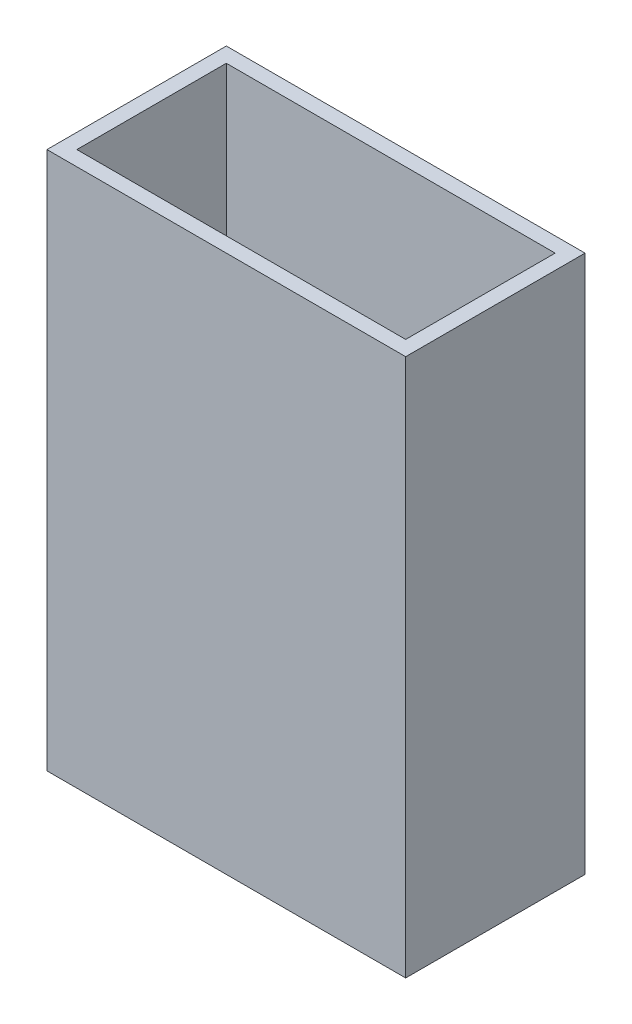
ISO-10303-21;
HEADER;
FILE_DESCRIPTION(('STEP AP214'),'2;1');
FILE_NAME('part.step','',(''),(''),'','','');
FILE_SCHEMA(('AUTOMOTIVE_DESIGN { 1 0 10303 214 1 1 1 1 }'));
ENDSEC;
DATA;
#1=APPLICATION_CONTEXT('core data for automotive mechanical design processes');
#2=APPLICATION_PROTOCOL_DEFINITION('international standard','automotive_design',2000,#1);
#3=PRODUCT_CONTEXT('',#1,'mechanical');
#4=PRODUCT('Part','Part','',(#3));
#5=PRODUCT_RELATED_PRODUCT_CATEGORY('part','',(#4));
#6=PRODUCT_DEFINITION_FORMATION('','',#4);
#7=PRODUCT_DEFINITION_CONTEXT('part definition',#1,'design');
#8=PRODUCT_DEFINITION('design','',#6,#7);
#9=PRODUCT_DEFINITION_SHAPE('','',#8);
#10=(LENGTH_UNIT() NAMED_UNIT(*) SI_UNIT(.MILLI.,.METRE.));
#11=(NAMED_UNIT(*) PLANE_ANGLE_UNIT() SI_UNIT($,.RADIAN.));
#12=(NAMED_UNIT(*) SI_UNIT($,.STERADIAN.) SOLID_ANGLE_UNIT());
#13=UNCERTAINTY_MEASURE_WITH_UNIT(LENGTH_MEASURE(1.E-05),#10,'distance_accuracy_value','');
#14=(GEOMETRIC_REPRESENTATION_CONTEXT(3) GLOBAL_UNCERTAINTY_ASSIGNED_CONTEXT((#13)) GLOBAL_UNIT_ASSIGNED_CONTEXT((#10,
#11,#12)) REPRESENTATION_CONTEXT('',''));
#15=CARTESIAN_POINT('',(0.,0.,0.));
#16=DIRECTION('',(0.,0.,1.));
#17=DIRECTION('',(1.,0.,0.));
#18=AXIS2_PLACEMENT_3D('',#15,#16,#17);
#19=CARTESIAN_POINT('',(0.,228.6,76.2));
#20=DIRECTION('',(0.,-1.,0.));
#21=DIRECTION('',(0.,0.,-1.));
#22=AXIS2_PLACEMENT_3D('',#19,#20,#21);
#23=PLANE('',#22);
#24=DIRECTION('',(-1.,0.,0.));
#25=VECTOR('',#24,1.);
#26=CARTESIAN_POINT('',(0.,228.6,0.));
#27=LINE('',#26,#25);
#28=CARTESIAN_POINT('',(152.4,228.6,0.));
#29=VERTEX_POINT('',#28);
#30=CARTESIAN_POINT('',(0.,228.6,0.));
#31=VERTEX_POINT('',#30);
#32=EDGE_CURVE('E83',#29,#31,#27,.T.);
#33=ORIENTED_EDGE('',*,*,#32,.T.);
#34=DIRECTION('',(0.,0.,-1.));
#35=VECTOR('',#34,1.);
#36=CARTESIAN_POINT('',(0.,228.6,76.2));
#37=LINE('',#36,#35);
#38=CARTESIAN_POINT('',(0.,228.6,76.2));
#39=VERTEX_POINT('',#38);
#40=EDGE_CURVE('E155',#39,#31,#37,.T.);
#41=ORIENTED_EDGE('',*,*,#40,.F.);
#42=DIRECTION('',(-1.,0.,0.));
#43=VECTOR('',#42,1.);
#44=CARTESIAN_POINT('',(0.,228.6,76.2));
#45=LINE('',#44,#43);
#46=CARTESIAN_POINT('',(152.4,228.6,76.2));
#47=VERTEX_POINT('',#46);
#48=EDGE_CURVE('E62',#47,#39,#45,.T.);
#49=ORIENTED_EDGE('',*,*,#48,.F.);
#50=DIRECTION('',(0.,0.,-1.));
#51=VECTOR('',#50,1.);
#52=CARTESIAN_POINT('',(152.4,228.6,76.2));
#53=LINE('',#52,#51);
#54=EDGE_CURVE('E165',#47,#29,#53,.T.);
#55=ORIENTED_EDGE('',*,*,#54,.T.);
#56=EDGE_LOOP('',(#33,#41,#49,#55));
#57=FACE_BOUND('',#56,.T.);
#58=DIRECTION('',(-1.,0.,0.));
#59=VECTOR('',#58,1.);
#60=CARTESIAN_POINT('',(0.,228.6,6.35));
#61=LINE('',#60,#59);
#62=CARTESIAN_POINT('',(146.05,228.6,6.35));
#63=VERTEX_POINT('',#62);
#64=CARTESIAN_POINT('',(6.35,228.6,6.35));
#65=VERTEX_POINT('',#64);
#66=EDGE_CURVE('E136',#63,#65,#61,.T.);
#67=ORIENTED_EDGE('',*,*,#66,.F.);
#68=DIRECTION('',(0.,0.,-1.));
#69=VECTOR('',#68,1.);
#70=CARTESIAN_POINT('',(146.05,228.6,76.2));
#71=LINE('',#70,#69);
#72=CARTESIAN_POINT('',(146.05,228.6,69.85));
#73=VERTEX_POINT('',#72);
#74=EDGE_CURVE('E131',#73,#63,#71,.T.);
#75=ORIENTED_EDGE('',*,*,#74,.F.);
#76=DIRECTION('',(-1.,0.,0.));
#77=VECTOR('',#76,1.);
#78=CARTESIAN_POINT('',(0.,228.6,69.85));
#79=LINE('',#78,#77);
#80=CARTESIAN_POINT('',(6.35,228.6,69.85));
#81=VERTEX_POINT('',#80);
#82=EDGE_CURVE('E53',#73,#81,#79,.T.);
#83=ORIENTED_EDGE('',*,*,#82,.T.);
#84=DIRECTION('',(0.,0.,-1.));
#85=VECTOR('',#84,1.);
#86=CARTESIAN_POINT('',(6.35,228.6,76.2));
#87=LINE('',#86,#85);
#88=EDGE_CURVE('E144',#81,#65,#87,.T.);
#89=ORIENTED_EDGE('',*,*,#88,.T.);
#90=EDGE_LOOP('',(#67,#75,#83,#89));
#91=FACE_BOUND('',#90,.T.);
#92=ADVANCED_FACE('F38',(#57,#91),#23,.F.);
#93=CARTESIAN_POINT('',(0.,0.,76.2));
#94=DIRECTION('',(1.,0.,0.));
#95=DIRECTION('',(0.,0.,-1.));
#96=AXIS2_PLACEMENT_3D('',#93,#94,#95);
#97=PLANE('',#96);
#98=DIRECTION('',(0.,-1.,0.));
#99=VECTOR('',#98,1.);
#100=CARTESIAN_POINT('',(0.,0.,0.));
#101=LINE('',#100,#99);
#102=CARTESIAN_POINT('',(0.,0.,0.));
#103=VERTEX_POINT('',#102);
#104=EDGE_CURVE('E156',#31,#103,#101,.T.);
#105=ORIENTED_EDGE('',*,*,#104,.T.);
#106=DIRECTION('',(0.,0.,-1.));
#107=VECTOR('',#106,1.);
#108=CARTESIAN_POINT('',(0.,0.,76.2));
#109=LINE('',#108,#107);
#110=CARTESIAN_POINT('',(0.,0.,76.2));
#111=VERTEX_POINT('',#110);
#112=EDGE_CURVE('E11',#111,#103,#109,.T.);
#113=ORIENTED_EDGE('',*,*,#112,.F.);
#114=DIRECTION('',(0.,-1.,0.));
#115=VECTOR('',#114,1.);
#116=CARTESIAN_POINT('',(0.,0.,76.2));
#117=LINE('',#116,#115);
#118=EDGE_CURVE('E149',#39,#111,#117,.T.);
#119=ORIENTED_EDGE('',*,*,#118,.F.);
#120=ORIENTED_EDGE('',*,*,#40,.T.);
#121=EDGE_LOOP('',(#105,#113,#119,#120));
#122=FACE_BOUND('',#121,.T.);
#123=ADVANCED_FACE('F40',(#122),#97,.F.);
#124=CARTESIAN_POINT('',(0.,0.,76.2));
#125=DIRECTION('',(0.,1.,0.));
#126=DIRECTION('',(0.,0.,1.));
#127=AXIS2_PLACEMENT_3D('',#124,#125,#126);
#128=PLANE('',#127);
#129=DIRECTION('',(1.,0.,0.));
#130=VECTOR('',#129,1.);
#131=CARTESIAN_POINT('',(0.,0.,0.));
#132=LINE('',#131,#130);
#133=CARTESIAN_POINT('',(152.4,0.,0.));
#134=VERTEX_POINT('',#133);
#135=EDGE_CURVE('E159',#103,#134,#132,.T.);
#136=ORIENTED_EDGE('',*,*,#135,.T.);
#137=DIRECTION('',(0.,0.,-1.));
#138=VECTOR('',#137,1.);
#139=CARTESIAN_POINT('',(152.4,0.,76.2));
#140=LINE('',#139,#138);
#141=CARTESIAN_POINT('',(152.4,0.,76.2));
#142=VERTEX_POINT('',#141);
#143=EDGE_CURVE('E46',#142,#134,#140,.T.);
#144=ORIENTED_EDGE('',*,*,#143,.F.);
#145=DIRECTION('',(1.,0.,0.));
#146=VECTOR('',#145,1.);
#147=CARTESIAN_POINT('',(0.,0.,76.2));
#148=LINE('',#147,#146);
#149=EDGE_CURVE('E90',#111,#142,#148,.T.);
#150=ORIENTED_EDGE('',*,*,#149,.F.);
#151=ORIENTED_EDGE('',*,*,#112,.T.);
#152=EDGE_LOOP('',(#136,#144,#150,#151));
#153=FACE_BOUND('',#152,.T.);
#154=ADVANCED_FACE('F204',(#153),#128,.F.);
#155=CARTESIAN_POINT('',(152.4,0.,76.2));
#156=DIRECTION('',(-1.,0.,0.));
#157=DIRECTION('',(0.,0.,1.));
#158=AXIS2_PLACEMENT_3D('',#155,#156,#157);
#159=PLANE('',#158);
#160=DIRECTION('',(0.,1.,0.));
#161=VECTOR('',#160,1.);
#162=CARTESIAN_POINT('',(152.4,0.,0.));
#163=LINE('',#162,#161);
#164=EDGE_CURVE('E161',#134,#29,#163,.T.);
#165=ORIENTED_EDGE('',*,*,#164,.T.);
#166=ORIENTED_EDGE('',*,*,#54,.F.);
#167=DIRECTION('',(0.,1.,0.));
#168=VECTOR('',#167,1.);
#169=CARTESIAN_POINT('',(152.4,0.,76.2));
#170=LINE('',#169,#168);
#171=EDGE_CURVE('E152',#142,#47,#170,.T.);
#172=ORIENTED_EDGE('',*,*,#171,.F.);
#173=ORIENTED_EDGE('',*,*,#143,.T.);
#174=EDGE_LOOP('',(#165,#166,#172,#173));
#175=FACE_BOUND('',#174,.T.);
#176=ADVANCED_FACE('F170',(#175),#159,.F.);
#177=CARTESIAN_POINT('',(0.,0.,76.2));
#178=DIRECTION('',(0.,0.,-1.));
#179=DIRECTION('',(-1.,0.,0.));
#180=AXIS2_PLACEMENT_3D('',#177,#178,#179);
#181=PLANE('',#180);
#182=ORIENTED_EDGE('',*,*,#118,.T.);
#183=ORIENTED_EDGE('',*,*,#149,.T.);
#184=ORIENTED_EDGE('',*,*,#171,.T.);
#185=ORIENTED_EDGE('',*,*,#48,.T.);
#186=EDGE_LOOP('',(#182,#183,#184,#185));
#187=FACE_BOUND('',#186,.T.);
#188=ADVANCED_FACE('F198',(#187),#181,.F.);
#189=CARTESIAN_POINT('',(0.,0.,0.));
#190=DIRECTION('',(0.,0.,-1.));
#191=DIRECTION('',(-1.,0.,0.));
#192=AXIS2_PLACEMENT_3D('',#189,#190,#191);
#193=PLANE('',#192);
#194=ORIENTED_EDGE('',*,*,#104,.F.);
#195=ORIENTED_EDGE('',*,*,#32,.F.);
#196=ORIENTED_EDGE('',*,*,#164,.F.);
#197=ORIENTED_EDGE('',*,*,#135,.F.);
#198=EDGE_LOOP('',(#194,#195,#196,#197));
#199=FACE_BOUND('',#198,.T.);
#200=ADVANCED_FACE('F174',(#199),#193,.T.);
#201=CARTESIAN_POINT('',(6.35,0.,76.2));
#202=DIRECTION('',(1.,0.,0.));
#203=DIRECTION('',(0.,0.,-1.));
#204=AXIS2_PLACEMENT_3D('',#201,#202,#203);
#205=PLANE('',#204);
#206=DIRECTION('',(0.,-1.,0.));
#207=VECTOR('',#206,1.);
#208=CARTESIAN_POINT('',(6.35,0.,6.35));
#209=LINE('',#208,#207);
#210=CARTESIAN_POINT('',(6.35,6.35,6.35));
#211=VERTEX_POINT('',#210);
#212=EDGE_CURVE('E120',#65,#211,#209,.T.);
#213=ORIENTED_EDGE('',*,*,#212,.F.);
#214=ORIENTED_EDGE('',*,*,#88,.F.);
#215=DIRECTION('',(0.,-1.,0.));
#216=VECTOR('',#215,1.);
#217=CARTESIAN_POINT('',(6.35,0.,69.85));
#218=LINE('',#217,#216);
#219=CARTESIAN_POINT('',(6.35,6.35,69.85));
#220=VERTEX_POINT('',#219);
#221=EDGE_CURVE('E138',#81,#220,#218,.T.);
#222=ORIENTED_EDGE('',*,*,#221,.T.);
#223=DIRECTION('',(0.,0.,-1.));
#224=VECTOR('',#223,1.);
#225=CARTESIAN_POINT('',(6.35,6.35,76.2));
#226=LINE('',#225,#224);
#227=EDGE_CURVE('E130',#220,#211,#226,.T.);
#228=ORIENTED_EDGE('',*,*,#227,.T.);
#229=EDGE_LOOP('',(#213,#214,#222,#228));
#230=FACE_BOUND('',#229,.T.);
#231=ADVANCED_FACE('F182',(#230),#205,.T.);
#232=CARTESIAN_POINT('',(0.,6.35,76.2));
#233=DIRECTION('',(0.,1.,0.));
#234=DIRECTION('',(0.,0.,1.));
#235=AXIS2_PLACEMENT_3D('',#232,#233,#234);
#236=PLANE('',#235);
#237=DIRECTION('',(1.,0.,0.));
#238=VECTOR('',#237,1.);
#239=CARTESIAN_POINT('',(0.,6.35,6.35));
#240=LINE('',#239,#238);
#241=CARTESIAN_POINT('',(146.05,6.35,6.35));
#242=VERTEX_POINT('',#241);
#243=EDGE_CURVE('E113',#211,#242,#240,.T.);
#244=ORIENTED_EDGE('',*,*,#243,.F.);
#245=ORIENTED_EDGE('',*,*,#227,.F.);
#246=DIRECTION('',(1.,0.,0.));
#247=VECTOR('',#246,1.);
#248=CARTESIAN_POINT('',(0.,6.35,69.85));
#249=LINE('',#248,#247);
#250=CARTESIAN_POINT('',(146.05,6.35,69.85));
#251=VERTEX_POINT('',#250);
#252=EDGE_CURVE('E128',#220,#251,#249,.T.);
#253=ORIENTED_EDGE('',*,*,#252,.T.);
#254=DIRECTION('',(0.,0.,-1.));
#255=VECTOR('',#254,1.);
#256=CARTESIAN_POINT('',(146.05,6.35,76.2));
#257=LINE('',#256,#255);
#258=EDGE_CURVE('E126',#251,#242,#257,.T.);
#259=ORIENTED_EDGE('',*,*,#258,.T.);
#260=EDGE_LOOP('',(#244,#245,#253,#259));
#261=FACE_BOUND('',#260,.T.);
#262=ADVANCED_FACE('F127',(#261),#236,.T.);
#263=CARTESIAN_POINT('',(146.05,0.,76.2));
#264=DIRECTION('',(-1.,0.,0.));
#265=DIRECTION('',(0.,0.,1.));
#266=AXIS2_PLACEMENT_3D('',#263,#264,#265);
#267=PLANE('',#266);
#268=DIRECTION('',(0.,1.,0.));
#269=VECTOR('',#268,1.);
#270=CARTESIAN_POINT('',(146.05,0.,6.35));
#271=LINE('',#270,#269);
#272=EDGE_CURVE('E117',#242,#63,#271,.T.);
#273=ORIENTED_EDGE('',*,*,#272,.F.);
#274=ORIENTED_EDGE('',*,*,#258,.F.);
#275=DIRECTION('',(0.,1.,0.));
#276=VECTOR('',#275,1.);
#277=CARTESIAN_POINT('',(146.05,0.,69.85));
#278=LINE('',#277,#276);
#279=EDGE_CURVE('E142',#251,#73,#278,.T.);
#280=ORIENTED_EDGE('',*,*,#279,.T.);
#281=ORIENTED_EDGE('',*,*,#74,.T.);
#282=EDGE_LOOP('',(#273,#274,#280,#281));
#283=FACE_BOUND('',#282,.T.);
#284=ADVANCED_FACE('F133',(#283),#267,.T.);
#285=CARTESIAN_POINT('',(0.,0.,69.85));
#286=DIRECTION('',(0.,0.,-1.));
#287=DIRECTION('',(-1.,0.,0.));
#288=AXIS2_PLACEMENT_3D('',#285,#286,#287);
#289=PLANE('',#288);
#290=ORIENTED_EDGE('',*,*,#221,.F.);
#291=ORIENTED_EDGE('',*,*,#82,.F.);
#292=ORIENTED_EDGE('',*,*,#279,.F.);
#293=ORIENTED_EDGE('',*,*,#252,.F.);
#294=EDGE_LOOP('',(#290,#291,#292,#293));
#295=FACE_BOUND('',#294,.T.);
#296=ADVANCED_FACE('F187',(#295),#289,.T.);
#297=CARTESIAN_POINT('',(0.,0.,6.35));
#298=DIRECTION('',(0.,0.,-1.));
#299=DIRECTION('',(-1.,0.,0.));
#300=AXIS2_PLACEMENT_3D('',#297,#298,#299);
#301=PLANE('',#300);
#302=ORIENTED_EDGE('',*,*,#212,.T.);
#303=ORIENTED_EDGE('',*,*,#243,.T.);
#304=ORIENTED_EDGE('',*,*,#272,.T.);
#305=ORIENTED_EDGE('',*,*,#66,.T.);
#306=EDGE_LOOP('',(#302,#303,#304,#305));
#307=FACE_BOUND('',#306,.T.);
#308=ADVANCED_FACE('F115',(#307),#301,.F.);
#309=CLOSED_SHELL('',(#92,#123,#154,#176,#188,#200,#231,#262,#284,#296,#308));
#310=MANIFOLD_SOLID_BREP('B2',#309);
#311=ADVANCED_BREP_SHAPE_REPRESENTATION('',(#18,#310),#14);
#312=SHAPE_DEFINITION_REPRESENTATION(#9,#311);
ENDSEC;
END-ISO-10303-21;
